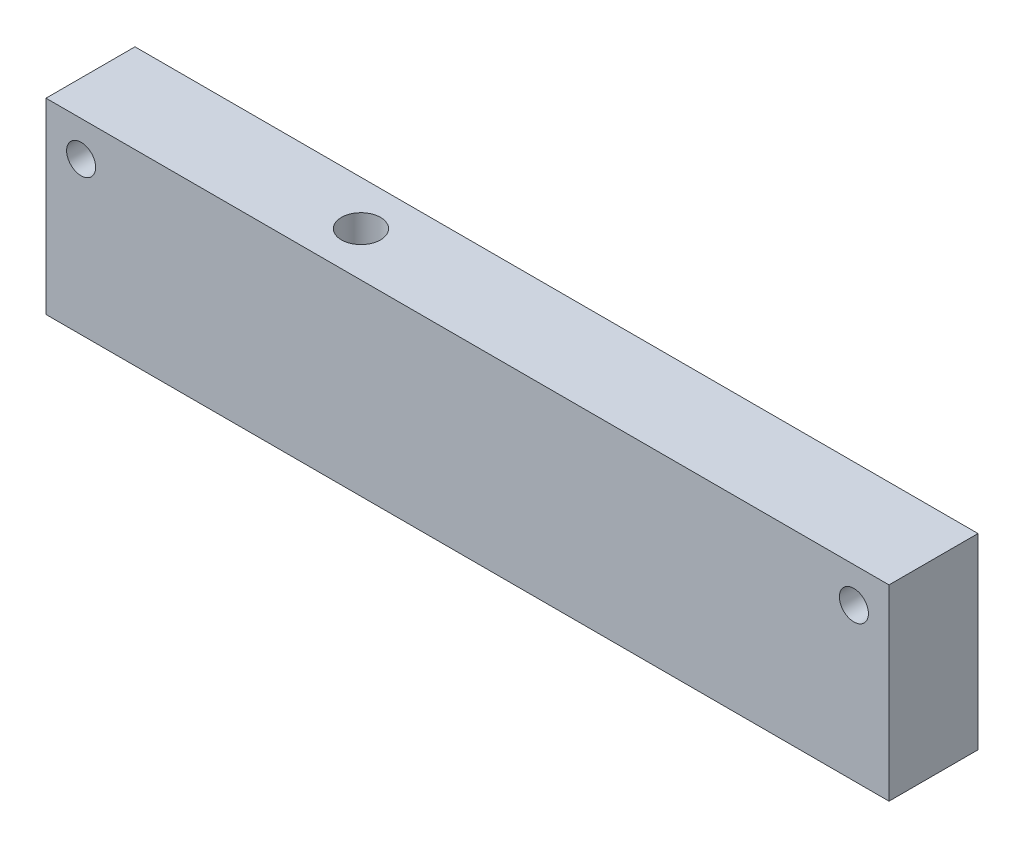
ISO-10303-21;
HEADER;
FILE_DESCRIPTION(('STEP AP214'),'2;1');
FILE_NAME('part.step','',(''),(''),'','','');
FILE_SCHEMA(('AUTOMOTIVE_DESIGN { 1 0 10303 214 1 1 1 1 }'));
ENDSEC;
DATA;
#1=APPLICATION_CONTEXT('core data for automotive mechanical design processes');
#2=APPLICATION_PROTOCOL_DEFINITION('international standard','automotive_design',2000,#1);
#3=PRODUCT_CONTEXT('',#1,'mechanical');
#4=PRODUCT('Part','Part','',(#3));
#5=PRODUCT_RELATED_PRODUCT_CATEGORY('part','',(#4));
#6=PRODUCT_DEFINITION_FORMATION('','',#4);
#7=PRODUCT_DEFINITION_CONTEXT('part definition',#1,'design');
#8=PRODUCT_DEFINITION('design','',#6,#7);
#9=PRODUCT_DEFINITION_SHAPE('','',#8);
#10=(LENGTH_UNIT() NAMED_UNIT(*) SI_UNIT(.MILLI.,.METRE.));
#11=(NAMED_UNIT(*) PLANE_ANGLE_UNIT() SI_UNIT($,.RADIAN.));
#12=(NAMED_UNIT(*) SI_UNIT($,.STERADIAN.) SOLID_ANGLE_UNIT());
#13=UNCERTAINTY_MEASURE_WITH_UNIT(LENGTH_MEASURE(1.E-05),#10,'distance_accuracy_value','');
#14=(GEOMETRIC_REPRESENTATION_CONTEXT(3) GLOBAL_UNCERTAINTY_ASSIGNED_CONTEXT((#13)) GLOBAL_UNIT_ASSIGNED_CONTEXT((#10,
#11,#12)) REPRESENTATION_CONTEXT('',''));
#15=CARTESIAN_POINT('',(0.,0.,0.));
#16=DIRECTION('',(0.,0.,1.));
#17=DIRECTION('',(1.,0.,0.));
#18=AXIS2_PLACEMENT_3D('',#15,#16,#17);
#19=CARTESIAN_POINT('',(82.5,32.5,-10.5));
#20=DIRECTION('',(0.,0.,1.));
#21=DIRECTION('',(1.,0.,0.));
#22=AXIS2_PLACEMENT_3D('',#19,#20,#21);
#23=CYLINDRICAL_SURFACE('',#22,3.1);
#24=CARTESIAN_POINT('',(82.5,32.5,9.5));
#25=DIRECTION('',(0.,0.,1.));
#26=DIRECTION('',(1.,0.,0.));
#27=AXIS2_PLACEMENT_3D('',#24,#25,#26);
#28=CIRCLE('',#27,3.1);
#29=CARTESIAN_POINT('',(85.6,32.5,9.5));
#30=VERTEX_POINT('',#29);
#31=EDGE_CURVE('E320',#30,#30,#28,.T.);
#32=ORIENTED_EDGE('',*,*,#31,.T.);
#33=EDGE_LOOP('',(#32));
#34=FACE_BOUND('',#33,.T.);
#35=CARTESIAN_POINT('',(82.5,32.5,0.3));
#36=DIRECTION('',(0.,0.,-1.));
#37=DIRECTION('',(-1.,0.,0.));
#38=AXIS2_PLACEMENT_3D('',#35,#36,#37);
#39=CIRCLE('',#38,3.1);
#40=CARTESIAN_POINT('',(79.4,32.5,0.3));
#41=VERTEX_POINT('',#40);
#42=EDGE_CURVE('E11',#41,#41,#39,.F.);
#43=ORIENTED_EDGE('',*,*,#42,.F.);
#44=EDGE_LOOP('',(#43));
#45=FACE_BOUND('',#44,.T.);
#46=ADVANCED_FACE('F41',(#34,#45),#23,.F.);
#47=CARTESIAN_POINT('',(-82.5,32.5,-10.5));
#48=DIRECTION('',(0.,0.,1.));
#49=DIRECTION('',(1.,0.,0.));
#50=AXIS2_PLACEMENT_3D('',#47,#48,#49);
#51=CYLINDRICAL_SURFACE('',#50,3.1);
#52=CARTESIAN_POINT('',(-82.5,32.5,9.5));
#53=DIRECTION('',(0.,0.,1.));
#54=DIRECTION('',(1.,0.,0.));
#55=AXIS2_PLACEMENT_3D('',#52,#53,#54);
#56=CIRCLE('',#55,3.1);
#57=CARTESIAN_POINT('',(-79.4,32.5,9.5));
#58=VERTEX_POINT('',#57);
#59=EDGE_CURVE('E105',#58,#58,#56,.T.);
#60=ORIENTED_EDGE('',*,*,#59,.T.);
#61=EDGE_LOOP('',(#60));
#62=FACE_BOUND('',#61,.T.);
#63=CARTESIAN_POINT('',(-82.5,32.5,0.300000000000002));
#64=DIRECTION('',(0.,0.,-1.));
#65=DIRECTION('',(-1.,0.,0.));
#66=AXIS2_PLACEMENT_3D('',#63,#64,#65);
#67=CIRCLE('',#66,3.1);
#68=CARTESIAN_POINT('',(-85.6,32.5,0.300000000000002));
#69=VERTEX_POINT('',#68);
#70=EDGE_CURVE('E49',#69,#69,#67,.F.);
#71=ORIENTED_EDGE('',*,*,#70,.F.);
#72=EDGE_LOOP('',(#71));
#73=FACE_BOUND('',#72,.T.);
#74=ADVANCED_FACE('F142',(#62,#73),#51,.F.);
#75=CARTESIAN_POINT('',(0.,0.,0.));
#76=DIRECTION('',(0.,-1.,0.));
#77=DIRECTION('',(0.,0.,-1.));
#78=AXIS2_PLACEMENT_3D('',#75,#76,#77);
#79=PLANE('',#78);
#80=CARTESIAN_POINT('',(82.5,0.,0.));
#81=DIRECTION('',(0.,1.,0.));
#82=DIRECTION('',(0.,0.,1.));
#83=AXIS2_PLACEMENT_3D('',#80,#81,#82);
#84=CIRCLE('',#83,3.1);
#85=CARTESIAN_POINT('',(82.5,0.,3.1));
#86=VERTEX_POINT('',#85);
#87=EDGE_CURVE('E115',#86,#86,#84,.T.);
#88=ORIENTED_EDGE('',*,*,#87,.T.);
#89=EDGE_LOOP('',(#88));
#90=FACE_BOUND('',#89,.T.);
#91=DIRECTION('',(0.,0.,-1.));
#92=VECTOR('',#91,1.);
#93=CARTESIAN_POINT('',(90.,0.,9.5));
#94=LINE('',#93,#92);
#95=CARTESIAN_POINT('',(90.,0.,9.5));
#96=VERTEX_POINT('',#95);
#97=CARTESIAN_POINT('',(90.,0.,-9.5));
#98=VERTEX_POINT('',#97);
#99=EDGE_CURVE('E126',#96,#98,#94,.T.);
#100=ORIENTED_EDGE('',*,*,#99,.F.);
#101=DIRECTION('',(1.,0.,0.));
#102=VECTOR('',#101,1.);
#103=CARTESIAN_POINT('',(-90.,0.,9.5));
#104=LINE('',#103,#102);
#105=CARTESIAN_POINT('',(-90.,0.,9.5));
#106=VERTEX_POINT('',#105);
#107=EDGE_CURVE('E56',#106,#96,#104,.T.);
#108=ORIENTED_EDGE('',*,*,#107,.F.);
#109=DIRECTION('',(0.,0.,1.));
#110=VECTOR('',#109,1.);
#111=CARTESIAN_POINT('',(-90.,0.,9.5));
#112=LINE('',#111,#110);
#113=CARTESIAN_POINT('',(-90.,0.,-9.5));
#114=VERTEX_POINT('',#113);
#115=EDGE_CURVE('E64',#114,#106,#112,.T.);
#116=ORIENTED_EDGE('',*,*,#115,.F.);
#117=DIRECTION('',(-1.,0.,0.));
#118=VECTOR('',#117,1.);
#119=CARTESIAN_POINT('',(-90.,0.,-9.5));
#120=LINE('',#119,#118);
#121=EDGE_CURVE('E129',#98,#114,#120,.T.);
#122=ORIENTED_EDGE('',*,*,#121,.F.);
#123=EDGE_LOOP('',(#100,#108,#116,#122));
#124=FACE_BOUND('',#123,.T.);
#125=CARTESIAN_POINT('',(-82.5,0.,0.));
#126=DIRECTION('',(0.,1.,0.));
#127=DIRECTION('',(0.,0.,1.));
#128=AXIS2_PLACEMENT_3D('',#125,#126,#127);
#129=CIRCLE('',#128,3.1);
#130=CARTESIAN_POINT('',(-82.5,0.,3.1));
#131=VERTEX_POINT('',#130);
#132=EDGE_CURVE('E121',#131,#131,#129,.T.);
#133=ORIENTED_EDGE('',*,*,#132,.T.);
#134=EDGE_LOOP('',(#133));
#135=FACE_BOUND('',#134,.T.);
#136=CARTESIAN_POINT('',(-32.25,0.,0.));
#137=DIRECTION('',(0.,1.,0.));
#138=DIRECTION('',(0.,0.,1.));
#139=AXIS2_PLACEMENT_3D('',#136,#137,#138);
#140=CIRCLE('',#139,4.175);
#141=CARTESIAN_POINT('',(-32.25,0.,4.175));
#142=VERTEX_POINT('',#141);
#143=EDGE_CURVE('E112',#142,#142,#140,.T.);
#144=ORIENTED_EDGE('',*,*,#143,.T.);
#145=EDGE_LOOP('',(#144));
#146=FACE_BOUND('',#145,.T.);
#147=ADVANCED_FACE('F144',(#90,#124,#135,#146),#79,.T.);
#148=CARTESIAN_POINT('',(90.,20.,9.5));
#149=DIRECTION('',(-1.,0.,0.));
#150=DIRECTION('',(0.,0.,1.));
#151=AXIS2_PLACEMENT_3D('',#148,#149,#150);
#152=PLANE('',#151);
#153=ORIENTED_EDGE('',*,*,#99,.T.);
#154=DIRECTION('',(0.,-1.,0.));
#155=VECTOR('',#154,1.);
#156=CARTESIAN_POINT('',(90.,20.,-9.5));
#157=LINE('',#156,#155);
#158=CARTESIAN_POINT('',(90.,40.,-9.5));
#159=VERTEX_POINT('',#158);
#160=EDGE_CURVE('E135',#159,#98,#157,.T.);
#161=ORIENTED_EDGE('',*,*,#160,.F.);
#162=DIRECTION('',(0.,0.,-1.));
#163=VECTOR('',#162,1.);
#164=CARTESIAN_POINT('',(90.,40.,-9.5));
#165=LINE('',#164,#163);
#166=CARTESIAN_POINT('',(90.,40.,9.5));
#167=VERTEX_POINT('',#166);
#168=EDGE_CURVE('E95',#167,#159,#165,.T.);
#169=ORIENTED_EDGE('',*,*,#168,.F.);
#170=DIRECTION('',(0.,-1.,0.));
#171=VECTOR('',#170,1.);
#172=CARTESIAN_POINT('',(90.,20.,9.5));
#173=LINE('',#172,#171);
#174=EDGE_CURVE('E87',#167,#96,#173,.T.);
#175=ORIENTED_EDGE('',*,*,#174,.T.);
#176=EDGE_LOOP('',(#153,#161,#169,#175));
#177=FACE_BOUND('',#176,.T.);
#178=ADVANCED_FACE('F43',(#177),#152,.F.);
#179=CARTESIAN_POINT('',(-90.,20.,-9.5));
#180=DIRECTION('',(0.,0.,1.));
#181=DIRECTION('',(1.,0.,0.));
#182=AXIS2_PLACEMENT_3D('',#179,#180,#181);
#183=PLANE('',#182);
#184=ORIENTED_EDGE('',*,*,#121,.T.);
#185=DIRECTION('',(0.,-1.,0.));
#186=VECTOR('',#185,1.);
#187=CARTESIAN_POINT('',(-90.,20.,-9.5));
#188=LINE('',#187,#186);
#189=CARTESIAN_POINT('',(-90.,40.,-9.5));
#190=VERTEX_POINT('',#189);
#191=EDGE_CURVE('E86',#190,#114,#188,.T.);
#192=ORIENTED_EDGE('',*,*,#191,.F.);
#193=DIRECTION('',(-1.,0.,0.));
#194=VECTOR('',#193,1.);
#195=CARTESIAN_POINT('',(-90.,40.,-9.5));
#196=LINE('',#195,#194);
#197=EDGE_CURVE('E101',#159,#190,#196,.T.);
#198=ORIENTED_EDGE('',*,*,#197,.F.);
#199=ORIENTED_EDGE('',*,*,#160,.T.);
#200=EDGE_LOOP('',(#184,#192,#198,#199));
#201=FACE_BOUND('',#200,.T.);
#202=ADVANCED_FACE('F183',(#201),#183,.F.);
#203=CARTESIAN_POINT('',(-90.,20.,9.5));
#204=DIRECTION('',(1.,0.,0.));
#205=DIRECTION('',(0.,0.,-1.));
#206=AXIS2_PLACEMENT_3D('',#203,#204,#205);
#207=PLANE('',#206);
#208=ORIENTED_EDGE('',*,*,#115,.T.);
#209=DIRECTION('',(0.,-1.,0.));
#210=VECTOR('',#209,1.);
#211=CARTESIAN_POINT('',(-90.,20.,9.5));
#212=LINE('',#211,#210);
#213=CARTESIAN_POINT('',(-90.,40.,9.5));
#214=VERTEX_POINT('',#213);
#215=EDGE_CURVE('E81',#214,#106,#212,.T.);
#216=ORIENTED_EDGE('',*,*,#215,.F.);
#217=DIRECTION('',(0.,0.,1.));
#218=VECTOR('',#217,1.);
#219=CARTESIAN_POINT('',(-90.,40.,-9.5));
#220=LINE('',#219,#218);
#221=EDGE_CURVE('E85',#190,#214,#220,.T.);
#222=ORIENTED_EDGE('',*,*,#221,.F.);
#223=ORIENTED_EDGE('',*,*,#191,.T.);
#224=EDGE_LOOP('',(#208,#216,#222,#223));
#225=FACE_BOUND('',#224,.T.);
#226=ADVANCED_FACE('F83',(#225),#207,.F.);
#227=CARTESIAN_POINT('',(-90.,20.,9.5));
#228=DIRECTION('',(0.,0.,-1.));
#229=DIRECTION('',(-1.,0.,0.));
#230=AXIS2_PLACEMENT_3D('',#227,#228,#229);
#231=PLANE('',#230);
#232=ORIENTED_EDGE('',*,*,#59,.F.);
#233=EDGE_LOOP('',(#232));
#234=FACE_BOUND('',#233,.T.);
#235=ORIENTED_EDGE('',*,*,#31,.F.);
#236=EDGE_LOOP('',(#235));
#237=FACE_BOUND('',#236,.T.);
#238=ORIENTED_EDGE('',*,*,#107,.T.);
#239=ORIENTED_EDGE('',*,*,#174,.F.);
#240=DIRECTION('',(1.,0.,0.));
#241=VECTOR('',#240,1.);
#242=CARTESIAN_POINT('',(-90.,40.,9.5));
#243=LINE('',#242,#241);
#244=EDGE_CURVE('E90',#214,#167,#243,.T.);
#245=ORIENTED_EDGE('',*,*,#244,.F.);
#246=ORIENTED_EDGE('',*,*,#215,.T.);
#247=EDGE_LOOP('',(#238,#239,#245,#246));
#248=FACE_BOUND('',#247,.T.);
#249=ADVANCED_FACE('F91',(#234,#237,#248),#231,.F.);
#250=CARTESIAN_POINT('',(-82.5,20.,0.));
#251=DIRECTION('',(0.,-1.,0.));
#252=DIRECTION('',(0.,0.,-1.));
#253=AXIS2_PLACEMENT_3D('',#250,#251,#252);
#254=CYLINDRICAL_SURFACE('',#253,3.1);
#255=CARTESIAN_POINT('',(-82.5,20.,0.));
#256=DIRECTION('',(0.,1.,0.));
#257=DIRECTION('',(0.,0.,1.));
#258=AXIS2_PLACEMENT_3D('',#255,#256,#257);
#259=CIRCLE('',#258,3.1);
#260=CARTESIAN_POINT('',(-82.5,20.,3.1));
#261=VERTEX_POINT('',#260);
#262=EDGE_CURVE('E116',#261,#261,#259,.T.);
#263=ORIENTED_EDGE('',*,*,#262,.T.);
#264=EDGE_LOOP('',(#263));
#265=FACE_BOUND('',#264,.T.);
#266=ORIENTED_EDGE('',*,*,#132,.F.);
#267=EDGE_LOOP('',(#266));
#268=FACE_BOUND('',#267,.T.);
#269=ADVANCED_FACE('F174',(#265,#268),#254,.F.);
#270=CARTESIAN_POINT('',(82.5,20.,0.));
#271=DIRECTION('',(0.,-1.,0.));
#272=DIRECTION('',(0.,0.,-1.));
#273=AXIS2_PLACEMENT_3D('',#270,#271,#272);
#274=CYLINDRICAL_SURFACE('',#273,3.1);
#275=CARTESIAN_POINT('',(82.5,20.,0.));
#276=DIRECTION('',(0.,1.,0.));
#277=DIRECTION('',(0.,0.,1.));
#278=AXIS2_PLACEMENT_3D('',#275,#276,#277);
#279=CIRCLE('',#278,3.1);
#280=CARTESIAN_POINT('',(82.5,20.,3.1));
#281=VERTEX_POINT('',#280);
#282=EDGE_CURVE('E111',#281,#281,#279,.T.);
#283=ORIENTED_EDGE('',*,*,#282,.T.);
#284=EDGE_LOOP('',(#283));
#285=FACE_BOUND('',#284,.T.);
#286=ORIENTED_EDGE('',*,*,#87,.F.);
#287=EDGE_LOOP('',(#286));
#288=FACE_BOUND('',#287,.T.);
#289=ADVANCED_FACE('F170',(#285,#288),#274,.F.);
#290=CARTESIAN_POINT('',(-32.25,20.,0.));
#291=DIRECTION('',(0.,-1.,0.));
#292=DIRECTION('',(0.,0.,-1.));
#293=AXIS2_PLACEMENT_3D('',#290,#291,#292);
#294=CYLINDRICAL_SURFACE('',#293,4.175);
#295=ORIENTED_EDGE('',*,*,#143,.F.);
#296=EDGE_LOOP('',(#295));
#297=FACE_BOUND('',#296,.T.);
#298=CARTESIAN_POINT('',(-32.25,40.,0.));
#299=DIRECTION('',(0.,1.,0.));
#300=DIRECTION('',(0.,0.,1.));
#301=AXIS2_PLACEMENT_3D('',#298,#299,#300);
#302=CIRCLE('',#301,4.175);
#303=CARTESIAN_POINT('',(-32.25,40.,4.175));
#304=VERTEX_POINT('',#303);
#305=EDGE_CURVE('E102',#304,#304,#302,.T.);
#306=ORIENTED_EDGE('',*,*,#305,.T.);
#307=EDGE_LOOP('',(#306));
#308=FACE_BOUND('',#307,.T.);
#309=ADVANCED_FACE('F167',(#297,#308),#294,.F.);
#310=CARTESIAN_POINT('',(0.,20.,0.));
#311=DIRECTION('',(0.,1.,0.));
#312=DIRECTION('',(0.,0.,1.));
#313=AXIS2_PLACEMENT_3D('',#310,#311,#312);
#314=PLANE('',#313);
#315=ORIENTED_EDGE('',*,*,#282,.F.);
#316=EDGE_LOOP('',(#315));
#317=FACE_BOUND('',#316,.T.);
#318=ADVANCED_FACE('F165',(#317),#314,.F.);
#319=ORIENTED_EDGE('',*,*,#262,.F.);
#320=EDGE_LOOP('',(#319));
#321=FACE_BOUND('',#320,.T.);
#322=ADVANCED_FACE('F162',(#321),#314,.F.);
#323=CARTESIAN_POINT('',(0.,40.,0.));
#324=DIRECTION('',(0.,1.,0.));
#325=DIRECTION('',(0.,0.,1.));
#326=AXIS2_PLACEMENT_3D('',#323,#324,#325);
#327=PLANE('',#326);
#328=ORIENTED_EDGE('',*,*,#221,.T.);
#329=ORIENTED_EDGE('',*,*,#244,.T.);
#330=ORIENTED_EDGE('',*,*,#168,.T.);
#331=ORIENTED_EDGE('',*,*,#197,.T.);
#332=EDGE_LOOP('',(#328,#329,#330,#331));
#333=FACE_BOUND('',#332,.T.);
#334=ORIENTED_EDGE('',*,*,#305,.F.);
#335=EDGE_LOOP('',(#334));
#336=FACE_BOUND('',#335,.T.);
#337=ADVANCED_FACE('F98',(#333,#336),#327,.T.);
#338=CARTESIAN_POINT('',(0.,0.,0.3));
#339=DIRECTION('',(0.,0.,-1.));
#340=DIRECTION('',(-1.,0.,0.));
#341=AXIS2_PLACEMENT_3D('',#338,#339,#340);
#342=PLANE('',#341);
#343=ORIENTED_EDGE('',*,*,#70,.T.);
#344=EDGE_LOOP('',(#343));
#345=FACE_BOUND('',#344,.T.);
#346=ADVANCED_FACE('F140',(#345),#342,.F.);
#347=CARTESIAN_POINT('',(82.5,32.5,0.3));
#348=DIRECTION('',(0.,0.,-1.));
#349=DIRECTION('',(-1.,0.,0.));
#350=AXIS2_PLACEMENT_3D('',#347,#348,#349);
#351=PLANE('',#350);
#352=ORIENTED_EDGE('',*,*,#42,.T.);
#353=EDGE_LOOP('',(#352));
#354=FACE_BOUND('',#353,.T.);
#355=ADVANCED_FACE('F252',(#354),#351,.F.);
#356=CLOSED_SHELL('',(#46,#74,#147,#178,#202,#226,#249,#269,#289,#309,#318,#322,#337,#346,#355));
#357=MANIFOLD_SOLID_BREP('B2',#356);
#358=ADVANCED_BREP_SHAPE_REPRESENTATION('',(#18,#357),#14);
#359=SHAPE_DEFINITION_REPRESENTATION(#9,#358);
ENDSEC;
END-ISO-10303-21;
